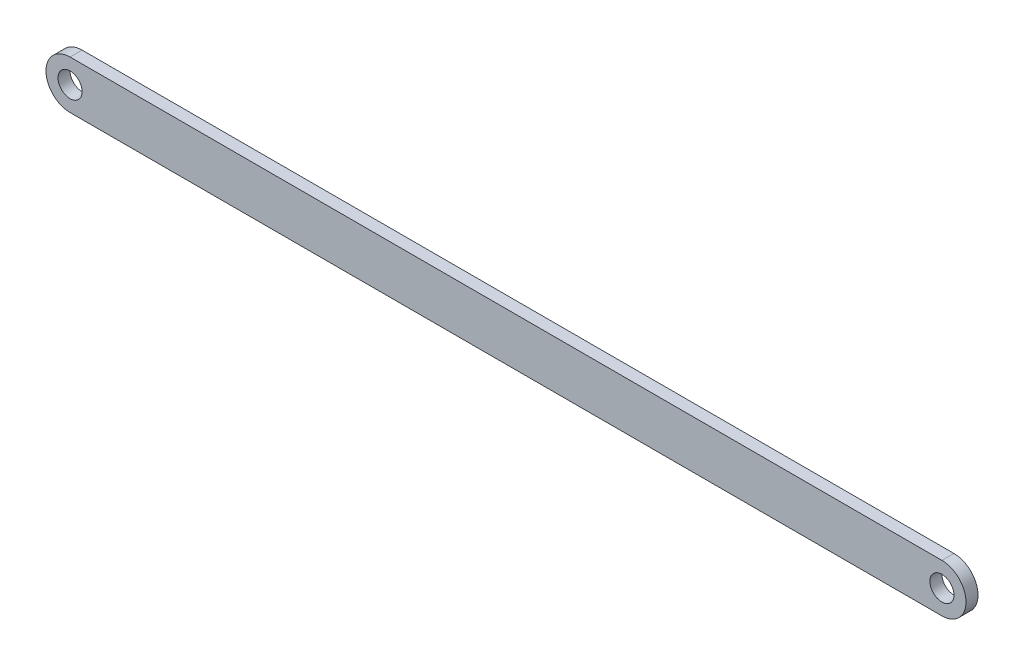
ISO-10303-21;
HEADER;
FILE_DESCRIPTION(('STEP AP214'),'2;1');
FILE_NAME('part.step','',(''),(''),'','','');
FILE_SCHEMA(('AUTOMOTIVE_DESIGN { 1 0 10303 214 1 1 1 1 }'));
ENDSEC;
DATA;
#1=APPLICATION_CONTEXT('core data for automotive mechanical design processes');
#2=APPLICATION_PROTOCOL_DEFINITION('international standard','automotive_design',2000,#1);
#3=PRODUCT_CONTEXT('',#1,'mechanical');
#4=PRODUCT('Part','Part','',(#3));
#5=PRODUCT_RELATED_PRODUCT_CATEGORY('part','',(#4));
#6=PRODUCT_DEFINITION_FORMATION('','',#4);
#7=PRODUCT_DEFINITION_CONTEXT('part definition',#1,'design');
#8=PRODUCT_DEFINITION('design','',#6,#7);
#9=PRODUCT_DEFINITION_SHAPE('','',#8);
#10=(LENGTH_UNIT() NAMED_UNIT(*) SI_UNIT(.MILLI.,.METRE.));
#11=(NAMED_UNIT(*) PLANE_ANGLE_UNIT() SI_UNIT($,.RADIAN.));
#12=(NAMED_UNIT(*) SI_UNIT($,.STERADIAN.) SOLID_ANGLE_UNIT());
#13=UNCERTAINTY_MEASURE_WITH_UNIT(LENGTH_MEASURE(1.E-05),#10,'distance_accuracy_value','');
#14=(GEOMETRIC_REPRESENTATION_CONTEXT(3) GLOBAL_UNCERTAINTY_ASSIGNED_CONTEXT((#13)) GLOBAL_UNIT_ASSIGNED_CONTEXT((#10,
#11,#12)) REPRESENTATION_CONTEXT('',''));
#15=CARTESIAN_POINT('',(0.,0.,0.));
#16=DIRECTION('',(0.,0.,1.));
#17=DIRECTION('',(1.,0.,0.));
#18=AXIS2_PLACEMENT_3D('',#15,#16,#17);
#19=CARTESIAN_POINT('',(-21.656050955414,-0.382165605095543,4.));
#20=DIRECTION('',(0.,0.,1.));
#21=DIRECTION('',(1.,0.,0.));
#22=AXIS2_PLACEMENT_3D('',#19,#20,#21);
#23=PLANE('',#22);
#24=CARTESIAN_POINT('',(-21.656050955414,-0.382165605095543,4.));
#25=DIRECTION('',(0.,0.,1.));
#26=DIRECTION('',(1.,0.,0.));
#27=AXIS2_PLACEMENT_3D('',#24,#25,#26);
#28=CIRCLE('',#27,4.);
#29=CARTESIAN_POINT('',(-17.656050955414,-0.382165605095543,4.));
#30=VERTEX_POINT('',#29);
#31=EDGE_CURVE('E106',#30,#30,#28,.T.);
#32=ORIENTED_EDGE('',*,*,#31,.F.);
#33=EDGE_LOOP('',(#32));
#34=FACE_BOUND('',#33,.T.);
#35=CARTESIAN_POINT('',(-21.656050955414,-0.382165605095543,4.));
#36=DIRECTION('',(0.,0.,1.));
#37=DIRECTION('',(1.,0.,0.));
#38=AXIS2_PLACEMENT_3D('',#35,#36,#37);
#39=CIRCLE('',#38,8.);
#40=CARTESIAN_POINT('',(-21.656050955414,7.61783439490446,4.));
#41=VERTEX_POINT('',#40);
#42=CARTESIAN_POINT('',(-21.656050955414,-8.38216560509554,4.));
#43=VERTEX_POINT('',#42);
#44=EDGE_CURVE('E91',#41,#43,#39,.T.);
#45=ORIENTED_EDGE('',*,*,#44,.T.);
#46=DIRECTION('',(1.,0.,0.));
#47=VECTOR('',#46,1.);
#48=CARTESIAN_POINT('',(-21.656050955414,-8.38216560509554,4.));
#49=LINE('',#48,#47);
#50=CARTESIAN_POINT('',(268.343949044586,-8.38216560509554,4.));
#51=VERTEX_POINT('',#50);
#52=EDGE_CURVE('E86',#43,#51,#49,.T.);
#53=ORIENTED_EDGE('',*,*,#52,.T.);
#54=CARTESIAN_POINT('',(268.343949044586,-0.382165605095543,4.));
#55=DIRECTION('',(0.,0.,1.));
#56=DIRECTION('',(1.,0.,0.));
#57=AXIS2_PLACEMENT_3D('',#54,#55,#56);
#58=CIRCLE('',#57,8.);
#59=CARTESIAN_POINT('',(268.343949044586,7.61783439490446,4.));
#60=VERTEX_POINT('',#59);
#61=EDGE_CURVE('E89',#51,#60,#58,.T.);
#62=ORIENTED_EDGE('',*,*,#61,.T.);
#63=DIRECTION('',(-1.,0.,0.));
#64=VECTOR('',#63,1.);
#65=CARTESIAN_POINT('',(-21.656050955414,7.61783439490446,4.));
#66=LINE('',#65,#64);
#67=EDGE_CURVE('E56',#60,#41,#66,.T.);
#68=ORIENTED_EDGE('',*,*,#67,.T.);
#69=EDGE_LOOP('',(#45,#53,#62,#68));
#70=FACE_BOUND('',#69,.T.);
#71=CARTESIAN_POINT('',(268.343949044586,-0.382165605095543,4.));
#72=DIRECTION('',(0.,0.,1.));
#73=DIRECTION('',(1.,0.,0.));
#74=AXIS2_PLACEMENT_3D('',#71,#72,#73);
#75=CIRCLE('',#74,3.99999999999999);
#76=CARTESIAN_POINT('',(272.343949044586,-0.382165605095543,4.));
#77=VERTEX_POINT('',#76);
#78=EDGE_CURVE('E121',#77,#77,#75,.T.);
#79=ORIENTED_EDGE('',*,*,#78,.F.);
#80=EDGE_LOOP('',(#79));
#81=FACE_BOUND('',#80,.T.);
#82=ADVANCED_FACE('F39',(#34,#70,#81),#23,.T.);
#83=CARTESIAN_POINT('',(-21.656050955414,-0.382165605095543,0.));
#84=DIRECTION('',(0.,0.,1.));
#85=DIRECTION('',(1.,0.,0.));
#86=AXIS2_PLACEMENT_3D('',#83,#84,#85);
#87=PLANE('',#86);
#88=CARTESIAN_POINT('',(-21.656050955414,-0.382165605095543,0.));
#89=DIRECTION('',(0.,0.,1.));
#90=DIRECTION('',(1.,0.,0.));
#91=AXIS2_PLACEMENT_3D('',#88,#89,#90);
#92=CIRCLE('',#91,8.);
#93=CARTESIAN_POINT('',(-21.656050955414,7.61783439490446,0.));
#94=VERTEX_POINT('',#93);
#95=CARTESIAN_POINT('',(-21.656050955414,-8.38216560509554,0.));
#96=VERTEX_POINT('',#95);
#97=EDGE_CURVE('E103',#94,#96,#92,.T.);
#98=ORIENTED_EDGE('',*,*,#97,.F.);
#99=DIRECTION('',(-1.,0.,0.));
#100=VECTOR('',#99,1.);
#101=CARTESIAN_POINT('',(-21.656050955414,7.61783439490446,0.));
#102=LINE('',#101,#100);
#103=CARTESIAN_POINT('',(268.343949044586,7.61783439490446,0.));
#104=VERTEX_POINT('',#103);
#105=EDGE_CURVE('E79',#104,#94,#102,.T.);
#106=ORIENTED_EDGE('',*,*,#105,.F.);
#107=CARTESIAN_POINT('',(268.343949044586,-0.382165605095543,0.));
#108=DIRECTION('',(0.,0.,1.));
#109=DIRECTION('',(1.,0.,0.));
#110=AXIS2_PLACEMENT_3D('',#107,#108,#109);
#111=CIRCLE('',#110,8.);
#112=CARTESIAN_POINT('',(268.343949044586,-8.38216560509554,0.));
#113=VERTEX_POINT('',#112);
#114=EDGE_CURVE('E73',#113,#104,#111,.T.);
#115=ORIENTED_EDGE('',*,*,#114,.F.);
#116=DIRECTION('',(1.,0.,0.));
#117=VECTOR('',#116,1.);
#118=CARTESIAN_POINT('',(-21.656050955414,-8.38216560509554,0.));
#119=LINE('',#118,#117);
#120=EDGE_CURVE('E95',#96,#113,#119,.T.);
#121=ORIENTED_EDGE('',*,*,#120,.F.);
#122=EDGE_LOOP('',(#98,#106,#115,#121));
#123=FACE_BOUND('',#122,.T.);
#124=CARTESIAN_POINT('',(-21.656050955414,-0.382165605095543,0.));
#125=DIRECTION('',(0.,0.,1.));
#126=DIRECTION('',(1.,0.,0.));
#127=AXIS2_PLACEMENT_3D('',#124,#125,#126);
#128=CIRCLE('',#127,4.);
#129=CARTESIAN_POINT('',(-17.656050955414,-0.382165605095543,0.));
#130=VERTEX_POINT('',#129);
#131=EDGE_CURVE('E118',#130,#130,#128,.T.);
#132=ORIENTED_EDGE('',*,*,#131,.T.);
#133=EDGE_LOOP('',(#132));
#134=FACE_BOUND('',#133,.T.);
#135=CARTESIAN_POINT('',(268.343949044586,-0.382165605095543,0.));
#136=DIRECTION('',(0.,0.,1.));
#137=DIRECTION('',(1.,0.,0.));
#138=AXIS2_PLACEMENT_3D('',#135,#136,#137);
#139=CIRCLE('',#138,3.99999999999999);
#140=CARTESIAN_POINT('',(272.343949044586,-0.382165605095543,0.));
#141=VERTEX_POINT('',#140);
#142=EDGE_CURVE('E124',#141,#141,#139,.T.);
#143=ORIENTED_EDGE('',*,*,#142,.T.);
#144=EDGE_LOOP('',(#143));
#145=FACE_BOUND('',#144,.T.);
#146=ADVANCED_FACE('F114',(#123,#134,#145),#87,.F.);
#147=CARTESIAN_POINT('',(-21.656050955414,-0.382165605095543,4.));
#148=DIRECTION('',(0.,0.,-1.));
#149=DIRECTION('',(-1.,0.,0.));
#150=AXIS2_PLACEMENT_3D('',#147,#148,#149);
#151=CYLINDRICAL_SURFACE('',#150,8.);
#152=ORIENTED_EDGE('',*,*,#97,.T.);
#153=DIRECTION('',(0.,0.,-1.));
#154=VECTOR('',#153,1.);
#155=CARTESIAN_POINT('',(-21.656050955414,-8.38216560509554,4.));
#156=LINE('',#155,#154);
#157=EDGE_CURVE('E11',#43,#96,#156,.T.);
#158=ORIENTED_EDGE('',*,*,#157,.F.);
#159=ORIENTED_EDGE('',*,*,#44,.F.);
#160=DIRECTION('',(0.,0.,-1.));
#161=VECTOR('',#160,1.);
#162=CARTESIAN_POINT('',(-21.656050955414,7.61783439490446,4.));
#163=LINE('',#162,#161);
#164=EDGE_CURVE('E99',#41,#94,#163,.T.);
#165=ORIENTED_EDGE('',*,*,#164,.T.);
#166=EDGE_LOOP('',(#152,#158,#159,#165));
#167=FACE_BOUND('',#166,.T.);
#168=ADVANCED_FACE('F41',(#167),#151,.T.);
#169=CARTESIAN_POINT('',(-21.656050955414,-8.38216560509554,4.));
#170=DIRECTION('',(0.,1.,0.));
#171=DIRECTION('',(0.,0.,1.));
#172=AXIS2_PLACEMENT_3D('',#169,#170,#171);
#173=PLANE('',#172);
#174=ORIENTED_EDGE('',*,*,#120,.T.);
#175=DIRECTION('',(0.,0.,-1.));
#176=VECTOR('',#175,1.);
#177=CARTESIAN_POINT('',(268.343949044586,-8.38216560509554,4.));
#178=LINE('',#177,#176);
#179=EDGE_CURVE('E48',#51,#113,#178,.T.);
#180=ORIENTED_EDGE('',*,*,#179,.F.);
#181=ORIENTED_EDGE('',*,*,#52,.F.);
#182=ORIENTED_EDGE('',*,*,#157,.T.);
#183=EDGE_LOOP('',(#174,#180,#181,#182));
#184=FACE_BOUND('',#183,.T.);
#185=ADVANCED_FACE('F94',(#184),#173,.F.);
#186=CARTESIAN_POINT('',(268.343949044586,-0.382165605095543,4.));
#187=DIRECTION('',(0.,0.,-1.));
#188=DIRECTION('',(-1.,0.,0.));
#189=AXIS2_PLACEMENT_3D('',#186,#187,#188);
#190=CYLINDRICAL_SURFACE('',#189,8.);
#191=ORIENTED_EDGE('',*,*,#114,.T.);
#192=DIRECTION('',(0.,0.,-1.));
#193=VECTOR('',#192,1.);
#194=CARTESIAN_POINT('',(268.343949044586,7.61783439490446,4.));
#195=LINE('',#194,#193);
#196=EDGE_CURVE('E96',#60,#104,#195,.T.);
#197=ORIENTED_EDGE('',*,*,#196,.F.);
#198=ORIENTED_EDGE('',*,*,#61,.F.);
#199=ORIENTED_EDGE('',*,*,#179,.T.);
#200=EDGE_LOOP('',(#191,#197,#198,#199));
#201=FACE_BOUND('',#200,.T.);
#202=ADVANCED_FACE('F97',(#201),#190,.T.);
#203=CARTESIAN_POINT('',(-21.656050955414,7.61783439490446,4.));
#204=DIRECTION('',(0.,-1.,0.));
#205=DIRECTION('',(0.,0.,-1.));
#206=AXIS2_PLACEMENT_3D('',#203,#204,#205);
#207=PLANE('',#206);
#208=ORIENTED_EDGE('',*,*,#105,.T.);
#209=ORIENTED_EDGE('',*,*,#164,.F.);
#210=ORIENTED_EDGE('',*,*,#67,.F.);
#211=ORIENTED_EDGE('',*,*,#196,.T.);
#212=EDGE_LOOP('',(#208,#209,#210,#211));
#213=FACE_BOUND('',#212,.T.);
#214=ADVANCED_FACE('F111',(#213),#207,.F.);
#215=CARTESIAN_POINT('',(-21.656050955414,-0.382165605095543,4.));
#216=DIRECTION('',(0.,0.,-1.));
#217=DIRECTION('',(-1.,0.,0.));
#218=AXIS2_PLACEMENT_3D('',#215,#216,#217);
#219=CYLINDRICAL_SURFACE('',#218,4.);
#220=ORIENTED_EDGE('',*,*,#31,.T.);
#221=EDGE_LOOP('',(#220));
#222=FACE_BOUND('',#221,.T.);
#223=ORIENTED_EDGE('',*,*,#131,.F.);
#224=EDGE_LOOP('',(#223));
#225=FACE_BOUND('',#224,.T.);
#226=ADVANCED_FACE('F141',(#222,#225),#219,.F.);
#227=CARTESIAN_POINT('',(268.343949044586,-0.382165605095543,4.));
#228=DIRECTION('',(0.,0.,-1.));
#229=DIRECTION('',(-1.,0.,0.));
#230=AXIS2_PLACEMENT_3D('',#227,#228,#229);
#231=CYLINDRICAL_SURFACE('',#230,3.99999999999999);
#232=ORIENTED_EDGE('',*,*,#78,.T.);
#233=EDGE_LOOP('',(#232));
#234=FACE_BOUND('',#233,.T.);
#235=ORIENTED_EDGE('',*,*,#142,.F.);
#236=EDGE_LOOP('',(#235));
#237=FACE_BOUND('',#236,.T.);
#238=ADVANCED_FACE('F130',(#234,#237),#231,.F.);
#239=CLOSED_SHELL('',(#82,#146,#168,#185,#202,#214,#226,#238));
#240=MANIFOLD_SOLID_BREP('B2',#239);
#241=ADVANCED_BREP_SHAPE_REPRESENTATION('',(#18,#240),#14);
#242=SHAPE_DEFINITION_REPRESENTATION(#9,#241);
ENDSEC;
END-ISO-10303-21;
